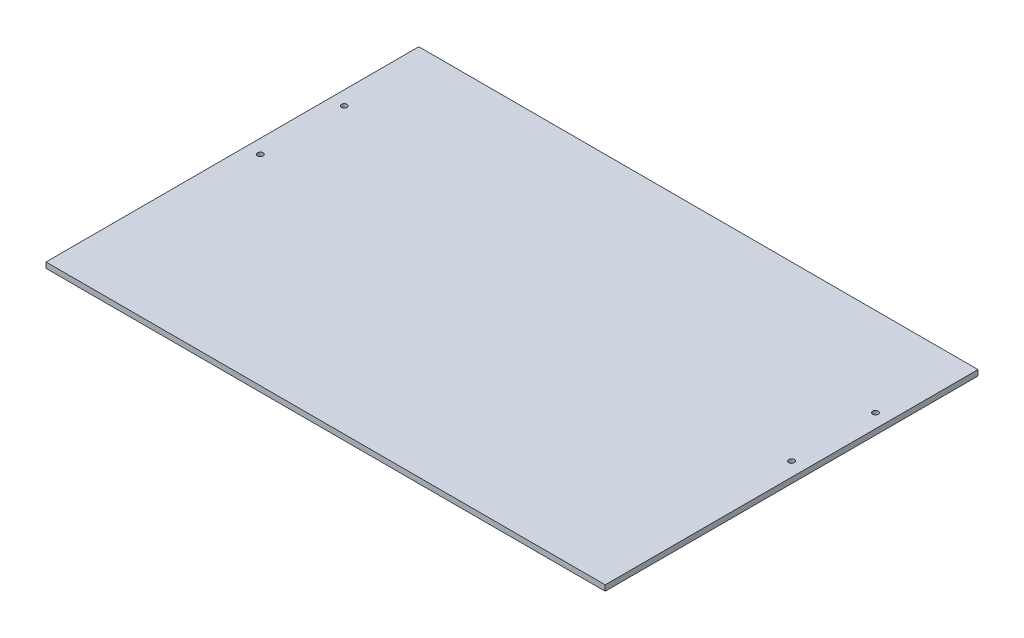
ISO-10303-21;
HEADER;
FILE_DESCRIPTION(('STEP AP214'),'2;1');
FILE_NAME('part.step','',(''),(''),'','','');
FILE_SCHEMA(('AUTOMOTIVE_DESIGN { 1 0 10303 214 1 1 1 1 }'));
ENDSEC;
DATA;
#1=APPLICATION_CONTEXT('core data for automotive mechanical design processes');
#2=APPLICATION_PROTOCOL_DEFINITION('international standard','automotive_design',2000,#1);
#3=PRODUCT_CONTEXT('',#1,'mechanical');
#4=PRODUCT('Part','Part','',(#3));
#5=PRODUCT_RELATED_PRODUCT_CATEGORY('part','',(#4));
#6=PRODUCT_DEFINITION_FORMATION('','',#4);
#7=PRODUCT_DEFINITION_CONTEXT('part definition',#1,'design');
#8=PRODUCT_DEFINITION('design','',#6,#7);
#9=PRODUCT_DEFINITION_SHAPE('','',#8);
#10=(LENGTH_UNIT() NAMED_UNIT(*) SI_UNIT(.MILLI.,.METRE.));
#11=(NAMED_UNIT(*) PLANE_ANGLE_UNIT() SI_UNIT($,.RADIAN.));
#12=(NAMED_UNIT(*) SI_UNIT($,.STERADIAN.) SOLID_ANGLE_UNIT());
#13=UNCERTAINTY_MEASURE_WITH_UNIT(LENGTH_MEASURE(1.E-05),#10,'distance_accuracy_value','');
#14=(GEOMETRIC_REPRESENTATION_CONTEXT(3) GLOBAL_UNCERTAINTY_ASSIGNED_CONTEXT((#13)) GLOBAL_UNIT_ASSIGNED_CONTEXT((#10,
#11,#12)) REPRESENTATION_CONTEXT('',''));
#15=CARTESIAN_POINT('',(0.,0.,0.));
#16=DIRECTION('',(0.,0.,1.));
#17=DIRECTION('',(1.,0.,0.));
#18=AXIS2_PLACEMENT_3D('',#15,#16,#17);
#19=CARTESIAN_POINT('',(0.,3.,0.));
#20=DIRECTION('',(0.,-1.,0.));
#21=DIRECTION('',(0.,0.,-1.));
#22=AXIS2_PLACEMENT_3D('',#19,#20,#21);
#23=PLANE('',#22);
#24=DIRECTION('',(0.,0.,-1.));
#25=VECTOR('',#24,1.);
#26=CARTESIAN_POINT('',(150.,3.,100.));
#27=LINE('',#26,#25);
#28=CARTESIAN_POINT('',(150.,3.,100.));
#29=VERTEX_POINT('',#28);
#30=CARTESIAN_POINT('',(150.,3.,-100.));
#31=VERTEX_POINT('',#30);
#32=EDGE_CURVE('E84',#29,#31,#27,.T.);
#33=ORIENTED_EDGE('',*,*,#32,.T.);
#34=DIRECTION('',(-1.,0.,0.));
#35=VECTOR('',#34,1.);
#36=CARTESIAN_POINT('',(-150.,3.,-100.));
#37=LINE('',#36,#35);
#38=CARTESIAN_POINT('',(-150.,3.,-100.));
#39=VERTEX_POINT('',#38);
#40=EDGE_CURVE('E79',#31,#39,#37,.T.);
#41=ORIENTED_EDGE('',*,*,#40,.T.);
#42=DIRECTION('',(0.,0.,1.));
#43=VECTOR('',#42,1.);
#44=CARTESIAN_POINT('',(-150.,3.,100.));
#45=LINE('',#44,#43);
#46=CARTESIAN_POINT('',(-150.,3.,100.));
#47=VERTEX_POINT('',#46);
#48=EDGE_CURVE('E82',#39,#47,#45,.T.);
#49=ORIENTED_EDGE('',*,*,#48,.T.);
#50=DIRECTION('',(1.,0.,0.));
#51=VECTOR('',#50,1.);
#52=CARTESIAN_POINT('',(-150.,3.,100.));
#53=LINE('',#52,#51);
#54=EDGE_CURVE('E49',#47,#29,#53,.T.);
#55=ORIENTED_EDGE('',*,*,#54,.T.);
#56=EDGE_LOOP('',(#33,#41,#49,#55));
#57=FACE_BOUND('',#56,.T.);
#58=CARTESIAN_POINT('',(-142.5,3.,-52.5));
#59=DIRECTION('',(0.,1.,0.));
#60=DIRECTION('',(0.,0.,1.));
#61=AXIS2_PLACEMENT_3D('',#58,#59,#60);
#62=CIRCLE('',#61,1.5);
#63=CARTESIAN_POINT('',(-142.5,3.,-51.));
#64=VERTEX_POINT('',#63);
#65=EDGE_CURVE('E99',#64,#64,#62,.T.);
#66=ORIENTED_EDGE('',*,*,#65,.F.);
#67=EDGE_LOOP('',(#66));
#68=FACE_BOUND('',#67,.T.);
#69=CARTESIAN_POINT('',(-142.5,3.,-7.49999999999996));
#70=DIRECTION('',(0.,1.,0.));
#71=DIRECTION('',(0.,0.,1.));
#72=AXIS2_PLACEMENT_3D('',#69,#70,#71);
#73=CIRCLE('',#72,1.5);
#74=CARTESIAN_POINT('',(-142.5,3.,-5.99999999999996));
#75=VERTEX_POINT('',#74);
#76=EDGE_CURVE('E114',#75,#75,#73,.T.);
#77=ORIENTED_EDGE('',*,*,#76,.F.);
#78=EDGE_LOOP('',(#77));
#79=FACE_BOUND('',#78,.T.);
#80=CARTESIAN_POINT('',(142.5,3.,-7.49999999999992));
#81=DIRECTION('',(0.,1.,0.));
#82=DIRECTION('',(0.,0.,-1.));
#83=AXIS2_PLACEMENT_3D('',#80,#81,#82);
#84=CIRCLE('',#83,1.5);
#85=CARTESIAN_POINT('',(142.5,3.,-8.99999999999992));
#86=VERTEX_POINT('',#85);
#87=EDGE_CURVE('E120',#86,#86,#84,.T.);
#88=ORIENTED_EDGE('',*,*,#87,.F.);
#89=EDGE_LOOP('',(#88));
#90=FACE_BOUND('',#89,.T.);
#91=CARTESIAN_POINT('',(142.5,3.,-52.5));
#92=DIRECTION('',(0.,1.,0.));
#93=DIRECTION('',(0.,0.,-1.));
#94=AXIS2_PLACEMENT_3D('',#91,#92,#93);
#95=CIRCLE('',#94,1.5);
#96=CARTESIAN_POINT('',(142.5,3.,-54.));
#97=VERTEX_POINT('',#96);
#98=EDGE_CURVE('E126',#97,#97,#95,.T.);
#99=ORIENTED_EDGE('',*,*,#98,.F.);
#100=EDGE_LOOP('',(#99));
#101=FACE_BOUND('',#100,.T.);
#102=ADVANCED_FACE('F32',(#57,#68,#79,#90,#101),#23,.F.);
#103=CARTESIAN_POINT('',(0.,0.,0.));
#104=DIRECTION('',(0.,-1.,0.));
#105=DIRECTION('',(0.,0.,-1.));
#106=AXIS2_PLACEMENT_3D('',#103,#104,#105);
#107=PLANE('',#106);
#108=CARTESIAN_POINT('',(142.5,0.,-7.49999999999992));
#109=DIRECTION('',(0.,1.,0.));
#110=DIRECTION('',(0.,0.,-1.));
#111=AXIS2_PLACEMENT_3D('',#108,#109,#110);
#112=CIRCLE('',#111,1.5);
#113=CARTESIAN_POINT('',(142.5,0.,-8.99999999999992));
#114=VERTEX_POINT('',#113);
#115=EDGE_CURVE('E123',#114,#114,#112,.T.);
#116=ORIENTED_EDGE('',*,*,#115,.T.);
#117=EDGE_LOOP('',(#116));
#118=FACE_BOUND('',#117,.T.);
#119=CARTESIAN_POINT('',(-142.5,0.,-52.5));
#120=DIRECTION('',(0.,1.,0.));
#121=DIRECTION('',(0.,0.,1.));
#122=AXIS2_PLACEMENT_3D('',#119,#120,#121);
#123=CIRCLE('',#122,1.5);
#124=CARTESIAN_POINT('',(-142.5,0.,-51.));
#125=VERTEX_POINT('',#124);
#126=EDGE_CURVE('E111',#125,#125,#123,.T.);
#127=ORIENTED_EDGE('',*,*,#126,.T.);
#128=EDGE_LOOP('',(#127));
#129=FACE_BOUND('',#128,.T.);
#130=DIRECTION('',(0.,0.,-1.));
#131=VECTOR('',#130,1.);
#132=CARTESIAN_POINT('',(150.,0.,100.));
#133=LINE('',#132,#131);
#134=CARTESIAN_POINT('',(150.,0.,100.));
#135=VERTEX_POINT('',#134);
#136=CARTESIAN_POINT('',(150.,0.,-100.));
#137=VERTEX_POINT('',#136);
#138=EDGE_CURVE('E96',#135,#137,#133,.T.);
#139=ORIENTED_EDGE('',*,*,#138,.F.);
#140=DIRECTION('',(1.,0.,0.));
#141=VECTOR('',#140,1.);
#142=CARTESIAN_POINT('',(-150.,0.,100.));
#143=LINE('',#142,#141);
#144=CARTESIAN_POINT('',(-150.,0.,100.));
#145=VERTEX_POINT('',#144);
#146=EDGE_CURVE('E72',#145,#135,#143,.T.);
#147=ORIENTED_EDGE('',*,*,#146,.F.);
#148=DIRECTION('',(0.,0.,1.));
#149=VECTOR('',#148,1.);
#150=CARTESIAN_POINT('',(-150.,0.,100.));
#151=LINE('',#150,#149);
#152=CARTESIAN_POINT('',(-150.,0.,-100.));
#153=VERTEX_POINT('',#152);
#154=EDGE_CURVE('E66',#153,#145,#151,.T.);
#155=ORIENTED_EDGE('',*,*,#154,.F.);
#156=DIRECTION('',(-1.,0.,0.));
#157=VECTOR('',#156,1.);
#158=CARTESIAN_POINT('',(-150.,0.,-100.));
#159=LINE('',#158,#157);
#160=EDGE_CURVE('E88',#137,#153,#159,.T.);
#161=ORIENTED_EDGE('',*,*,#160,.F.);
#162=EDGE_LOOP('',(#139,#147,#155,#161));
#163=FACE_BOUND('',#162,.T.);
#164=CARTESIAN_POINT('',(-142.5,0.,-7.49999999999996));
#165=DIRECTION('',(0.,1.,0.));
#166=DIRECTION('',(0.,0.,1.));
#167=AXIS2_PLACEMENT_3D('',#164,#165,#166);
#168=CIRCLE('',#167,1.5);
#169=CARTESIAN_POINT('',(-142.5,0.,-5.99999999999996));
#170=VERTEX_POINT('',#169);
#171=EDGE_CURVE('E117',#170,#170,#168,.T.);
#172=ORIENTED_EDGE('',*,*,#171,.T.);
#173=EDGE_LOOP('',(#172));
#174=FACE_BOUND('',#173,.T.);
#175=CARTESIAN_POINT('',(142.5,0.,-52.5));
#176=DIRECTION('',(0.,1.,0.));
#177=DIRECTION('',(0.,0.,-1.));
#178=AXIS2_PLACEMENT_3D('',#175,#176,#177);
#179=CIRCLE('',#178,1.5);
#180=CARTESIAN_POINT('',(142.5,0.,-54.));
#181=VERTEX_POINT('',#180);
#182=EDGE_CURVE('E129',#181,#181,#179,.T.);
#183=ORIENTED_EDGE('',*,*,#182,.T.);
#184=EDGE_LOOP('',(#183));
#185=FACE_BOUND('',#184,.T.);
#186=ADVANCED_FACE('F107',(#118,#129,#163,#174,#185),#107,.T.);
#187=CARTESIAN_POINT('',(150.,3.,100.));
#188=DIRECTION('',(-1.,0.,0.));
#189=DIRECTION('',(0.,0.,1.));
#190=AXIS2_PLACEMENT_3D('',#187,#188,#189);
#191=PLANE('',#190);
#192=ORIENTED_EDGE('',*,*,#138,.T.);
#193=DIRECTION('',(0.,-1.,0.));
#194=VECTOR('',#193,1.);
#195=CARTESIAN_POINT('',(150.,3.,-100.));
#196=LINE('',#195,#194);
#197=EDGE_CURVE('E11',#31,#137,#196,.T.);
#198=ORIENTED_EDGE('',*,*,#197,.F.);
#199=ORIENTED_EDGE('',*,*,#32,.F.);
#200=DIRECTION('',(0.,-1.,0.));
#201=VECTOR('',#200,1.);
#202=CARTESIAN_POINT('',(150.,3.,100.));
#203=LINE('',#202,#201);
#204=EDGE_CURVE('E92',#29,#135,#203,.T.);
#205=ORIENTED_EDGE('',*,*,#204,.T.);
#206=EDGE_LOOP('',(#192,#198,#199,#205));
#207=FACE_BOUND('',#206,.T.);
#208=ADVANCED_FACE('F34',(#207),#191,.F.);
#209=CARTESIAN_POINT('',(-150.,3.,-100.));
#210=DIRECTION('',(0.,0.,1.));
#211=DIRECTION('',(1.,0.,0.));
#212=AXIS2_PLACEMENT_3D('',#209,#210,#211);
#213=PLANE('',#212);
#214=ORIENTED_EDGE('',*,*,#160,.T.);
#215=DIRECTION('',(0.,-1.,0.));
#216=VECTOR('',#215,1.);
#217=CARTESIAN_POINT('',(-150.,3.,-100.));
#218=LINE('',#217,#216);
#219=EDGE_CURVE('E41',#39,#153,#218,.T.);
#220=ORIENTED_EDGE('',*,*,#219,.F.);
#221=ORIENTED_EDGE('',*,*,#40,.F.);
#222=ORIENTED_EDGE('',*,*,#197,.T.);
#223=EDGE_LOOP('',(#214,#220,#221,#222));
#224=FACE_BOUND('',#223,.T.);
#225=ADVANCED_FACE('F87',(#224),#213,.F.);
#226=CARTESIAN_POINT('',(-150.,3.,100.));
#227=DIRECTION('',(1.,0.,0.));
#228=DIRECTION('',(0.,0.,-1.));
#229=AXIS2_PLACEMENT_3D('',#226,#227,#228);
#230=PLANE('',#229);
#231=ORIENTED_EDGE('',*,*,#154,.T.);
#232=DIRECTION('',(0.,-1.,0.));
#233=VECTOR('',#232,1.);
#234=CARTESIAN_POINT('',(-150.,3.,100.));
#235=LINE('',#234,#233);
#236=EDGE_CURVE('E89',#47,#145,#235,.T.);
#237=ORIENTED_EDGE('',*,*,#236,.F.);
#238=ORIENTED_EDGE('',*,*,#48,.F.);
#239=ORIENTED_EDGE('',*,*,#219,.T.);
#240=EDGE_LOOP('',(#231,#237,#238,#239));
#241=FACE_BOUND('',#240,.T.);
#242=ADVANCED_FACE('F90',(#241),#230,.F.);
#243=CARTESIAN_POINT('',(-150.,3.,100.));
#244=DIRECTION('',(0.,0.,-1.));
#245=DIRECTION('',(-1.,0.,0.));
#246=AXIS2_PLACEMENT_3D('',#243,#244,#245);
#247=PLANE('',#246);
#248=ORIENTED_EDGE('',*,*,#146,.T.);
#249=ORIENTED_EDGE('',*,*,#204,.F.);
#250=ORIENTED_EDGE('',*,*,#54,.F.);
#251=ORIENTED_EDGE('',*,*,#236,.T.);
#252=EDGE_LOOP('',(#248,#249,#250,#251));
#253=FACE_BOUND('',#252,.T.);
#254=ADVANCED_FACE('F104',(#253),#247,.F.);
#255=CARTESIAN_POINT('',(-142.5,3.,-52.5));
#256=DIRECTION('',(0.,-1.,0.));
#257=DIRECTION('',(0.,0.,-1.));
#258=AXIS2_PLACEMENT_3D('',#255,#256,#257);
#259=CYLINDRICAL_SURFACE('',#258,1.5);
#260=ORIENTED_EDGE('',*,*,#65,.T.);
#261=EDGE_LOOP('',(#260));
#262=FACE_BOUND('',#261,.T.);
#263=ORIENTED_EDGE('',*,*,#126,.F.);
#264=EDGE_LOOP('',(#263));
#265=FACE_BOUND('',#264,.T.);
#266=ADVANCED_FACE('F146',(#262,#265),#259,.F.);
#267=CARTESIAN_POINT('',(-142.5,3.,-7.49999999999996));
#268=DIRECTION('',(0.,-1.,0.));
#269=DIRECTION('',(0.,0.,-1.));
#270=AXIS2_PLACEMENT_3D('',#267,#268,#269);
#271=CYLINDRICAL_SURFACE('',#270,1.5);
#272=ORIENTED_EDGE('',*,*,#76,.T.);
#273=EDGE_LOOP('',(#272));
#274=FACE_BOUND('',#273,.T.);
#275=ORIENTED_EDGE('',*,*,#171,.F.);
#276=EDGE_LOOP('',(#275));
#277=FACE_BOUND('',#276,.T.);
#278=ADVANCED_FACE('F192',(#274,#277),#271,.F.);
#279=CARTESIAN_POINT('',(142.5,3.,-7.49999999999992));
#280=DIRECTION('',(0.,-1.,0.));
#281=DIRECTION('',(0.,0.,-1.));
#282=AXIS2_PLACEMENT_3D('',#279,#280,#281);
#283=CYLINDRICAL_SURFACE('',#282,1.5);
#284=ORIENTED_EDGE('',*,*,#87,.T.);
#285=EDGE_LOOP('',(#284));
#286=FACE_BOUND('',#285,.T.);
#287=ORIENTED_EDGE('',*,*,#115,.F.);
#288=EDGE_LOOP('',(#287));
#289=FACE_BOUND('',#288,.T.);
#290=ADVANCED_FACE('F200',(#286,#289),#283,.F.);
#291=CARTESIAN_POINT('',(142.5,3.,-52.5));
#292=DIRECTION('',(0.,-1.,0.));
#293=DIRECTION('',(0.,0.,-1.));
#294=AXIS2_PLACEMENT_3D('',#291,#292,#293);
#295=CYLINDRICAL_SURFACE('',#294,1.5);
#296=ORIENTED_EDGE('',*,*,#98,.T.);
#297=EDGE_LOOP('',(#296));
#298=FACE_BOUND('',#297,.T.);
#299=ORIENTED_EDGE('',*,*,#182,.F.);
#300=EDGE_LOOP('',(#299));
#301=FACE_BOUND('',#300,.T.);
#302=ADVANCED_FACE('F135',(#298,#301),#295,.F.);
#303=CLOSED_SHELL('',(#102,#186,#208,#225,#242,#254,#266,#278,#290,#302));
#304=MANIFOLD_SOLID_BREP('B2',#303);
#305=ADVANCED_BREP_SHAPE_REPRESENTATION('',(#18,#304),#14);
#306=SHAPE_DEFINITION_REPRESENTATION(#9,#305);
ENDSEC;
END-ISO-10303-21;
